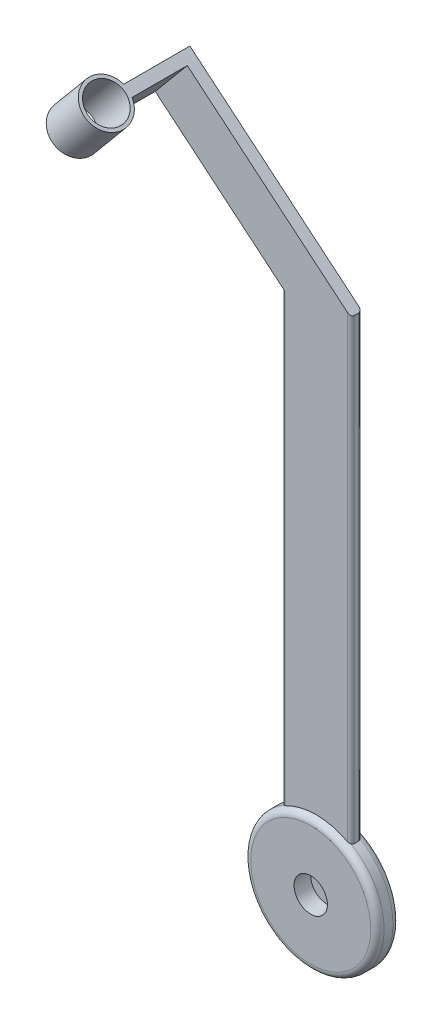
ISO-10303-21;
HEADER;
FILE_DESCRIPTION(('STEP AP214'),'2;1');
FILE_NAME('part.step','',(''),(''),'','','');
FILE_SCHEMA(('AUTOMOTIVE_DESIGN { 1 0 10303 214 1 1 1 1 }'));
ENDSEC;
DATA;
#1=APPLICATION_CONTEXT('core data for automotive mechanical design processes');
#2=APPLICATION_PROTOCOL_DEFINITION('international standard','automotive_design',2000,#1);
#3=PRODUCT_CONTEXT('',#1,'mechanical');
#4=PRODUCT('Part','Part','',(#3));
#5=PRODUCT_RELATED_PRODUCT_CATEGORY('part','',(#4));
#6=PRODUCT_DEFINITION_FORMATION('','',#4);
#7=PRODUCT_DEFINITION_CONTEXT('part definition',#1,'design');
#8=PRODUCT_DEFINITION('design','',#6,#7);
#9=PRODUCT_DEFINITION_SHAPE('','',#8);
#10=(LENGTH_UNIT() NAMED_UNIT(*) SI_UNIT(.MILLI.,.METRE.));
#11=(NAMED_UNIT(*) PLANE_ANGLE_UNIT() SI_UNIT($,.RADIAN.));
#12=(NAMED_UNIT(*) SI_UNIT($,.STERADIAN.) SOLID_ANGLE_UNIT());
#13=UNCERTAINTY_MEASURE_WITH_UNIT(LENGTH_MEASURE(1.E-05),#10,'distance_accuracy_value','');
#14=(GEOMETRIC_REPRESENTATION_CONTEXT(3) GLOBAL_UNCERTAINTY_ASSIGNED_CONTEXT((#13)) GLOBAL_UNIT_ASSIGNED_CONTEXT((#10,
#11,#12)) REPRESENTATION_CONTEXT('',''));
#15=CARTESIAN_POINT('',(0.,0.,0.));
#16=DIRECTION('',(0.,0.,1.));
#17=DIRECTION('',(1.,0.,0.));
#18=AXIS2_PLACEMENT_3D('',#15,#16,#17);
#19=CARTESIAN_POINT('',(0.,0.,5.));
#20=DIRECTION('',(0.,0.,1.));
#21=DIRECTION('',(1.,0.,0.));
#22=AXIS2_PLACEMENT_3D('',#19,#20,#21);
#23=PLANE('',#22);
#24=CARTESIAN_POINT('',(0.,0.,5.));
#25=DIRECTION('',(0.,0.,1.));
#26=DIRECTION('',(1.,0.,0.));
#27=AXIS2_PLACEMENT_3D('',#24,#25,#26);
#28=CIRCLE('',#27,59.9160797830996);
#29=CARTESIAN_POINT('',(-28.,52.971092272812,5.));
#30=VERTEX_POINT('',#29);
#31=CARTESIAN_POINT('',(27.9999999999984,52.9710922728128,5.));
#32=VERTEX_POINT('',#31);
#33=EDGE_CURVE('E212',#30,#32,#28,.F.);
#34=ORIENTED_EDGE('',*,*,#33,.T.);
#35=DIRECTION('',(0.,1.,0.));
#36=VECTOR('',#35,1.);
#37=CARTESIAN_POINT('',(28.,462.733371390838,5.));
#38=LINE('',#37,#36);
#39=CARTESIAN_POINT('',(28.0000000000001,465.237714708431,5.));
#40=VERTEX_POINT('',#39);
#41=EDGE_CURVE('E147',#32,#40,#38,.T.);
#42=ORIENTED_EDGE('',*,*,#41,.T.);
#43=DIRECTION('',(-0.767674400608539,0.640840085083884,0.));
#44=VECTOR('',#43,1.);
#45=CARTESIAN_POINT('',(-123.685053787557,591.861531652329,5.));
#46=LINE('',#45,#44);
#47=CARTESIAN_POINT('',(-116.008309781471,585.45313080149,5.));
#48=VERTEX_POINT('',#47);
#49=EDGE_CURVE('E140',#40,#48,#46,.T.);
#50=ORIENTED_EDGE('',*,*,#49,.T.);
#51=DIRECTION('',(0.640840085083885,0.767674400608539,0.));
#52=VECTOR('',#51,1.);
#53=CARTESIAN_POINT('',(-144.846113610246,550.907782774105,5.));
#54=LINE('',#53,#52);
#55=CARTESIAN_POINT('',(-144.846113610246,550.907782774105,5.));
#56=VERTEX_POINT('',#55);
#57=EDGE_CURVE('E144',#56,#48,#54,.T.);
#58=ORIENTED_EDGE('',*,*,#57,.F.);
#59=DIRECTION('',(0.767674400608539,-0.640840085083885,0.));
#60=VECTOR('',#59,1.);
#61=CARTESIAN_POINT('',(-31.,455.871198156165,5.));
#62=LINE('',#61,#60);
#63=CARTESIAN_POINT('',(-28.,453.366854838572,5.));
#64=VERTEX_POINT('',#63);
#65=EDGE_CURVE('E149',#56,#64,#62,.T.);
#66=ORIENTED_EDGE('',*,*,#65,.T.);
#67=DIRECTION('',(0.,-1.,0.));
#68=VECTOR('',#67,1.);
#69=CARTESIAN_POINT('',(-28.,51.2731568813035,5.));
#70=LINE('',#69,#68);
#71=EDGE_CURVE('E231',#64,#30,#70,.T.);
#72=ORIENTED_EDGE('',*,*,#71,.T.);
#73=EDGE_LOOP('',(#34,#42,#50,#58,#66,#72));
#74=FACE_BOUND('',#73,.T.);
#75=ADVANCED_FACE('F37',(#74),#23,.T.);
#76=CARTESIAN_POINT('',(0.,0.,10.));
#77=DIRECTION('',(0.,0.,-1.));
#78=DIRECTION('',(-1.,0.,0.));
#79=AXIS2_PLACEMENT_3D('',#76,#77,#78);
#80=CYLINDRICAL_SURFACE('',#79,60.);
#81=DIRECTION('',(0.,0.,-1.));
#82=VECTOR('',#81,1.);
#83=CARTESIAN_POINT('',(31.,51.3711981561653,5.));
#84=LINE('',#83,#82);
#85=CARTESIAN_POINT('',(31.,51.3711981561653,2.));
#86=VERTEX_POINT('',#85);
#87=CARTESIAN_POINT('',(31.,51.3711981561653,-2.));
#88=VERTEX_POINT('',#87);
#89=EDGE_CURVE('E193',#86,#88,#84,.T.);
#90=ORIENTED_EDGE('',*,*,#89,.F.);
#91=CARTESIAN_POINT('',(30.9999999999984,51.3711981561653,2.));
#92=CARTESIAN_POINT('',(31.0000135138602,51.3711886335819,2.07598113541307));
#93=CARTESIAN_POINT('',(30.9971138372125,51.3729397825167,2.15195414419648));
#94=CARTESIAN_POINT('',(30.9855914376383,51.3798910633123,2.30327943367493));
#95=CARTESIAN_POINT('',(30.9769707836917,51.3850899483058,2.37863192880714));
#96=CARTESIAN_POINT('',(30.9541612744216,51.3988333183854,2.52782964930783));
#97=CARTESIAN_POINT('',(30.9399977542431,51.4073625807009,2.60168014670068));
#98=CARTESIAN_POINT('',(30.9063027352149,51.4276271639147,2.74767917808667));
#99=CARTESIAN_POINT('',(30.886771072516,51.4393625826729,2.81982766005706));
#100=CARTESIAN_POINT('',(30.8205150646459,51.4791077077944,3.03283060196538));
#101=CARTESIAN_POINT('',(30.766084911078,51.5116834375269,3.17052851994915));
#102=CARTESIAN_POINT('',(30.6390679760402,51.5873330410684,3.43414464767918));
#103=CARTESIAN_POINT('',(30.5664708109147,51.6304129183344,3.56005606390773));
#104=CARTESIAN_POINT('',(30.4477912820482,51.700425524385,3.73581149028256));
#105=CARTESIAN_POINT('',(30.4076177259652,51.724067226756,3.79108982338713));
#106=CARTESIAN_POINT('',(30.3241415292913,51.7730506942354,3.89814511442525));
#107=CARTESIAN_POINT('',(30.2808484213061,51.7983872645411,3.94993187524366));
#108=CARTESIAN_POINT('',(30.2360679774982,51.8245134396852,4.));
#109=B_SPLINE_CURVE_WITH_KNOTS('',3,(#91,#92,#93,#94,#95,#96,#97,#98,#99,#100,#101,#102,#103,
#104,#105,#106,#107,#108),.UNSPECIFIED.,.F.,.F.,(4,2,2,2,2,2,2,2,4),(0.,0.227854449547202,
0.455626540868479,0.682369475436166,0.909119331534355,1.36175812512467,1.81465622518201,
2.03143620298439,2.24757975899714),.UNSPECIFIED.);
#110=CARTESIAN_POINT('',(30.2360679774982,51.8245134396852,4.));
#111=VERTEX_POINT('',#110);
#112=EDGE_CURVE('E288',#86,#111,#109,.T.);
#113=ORIENTED_EDGE('',*,*,#112,.T.);
#114=CARTESIAN_POINT('',(0.,0.,4.));
#115=DIRECTION('',(0.,0.,1.));
#116=DIRECTION('',(1.,0.,0.));
#117=AXIS2_PLACEMENT_3D('',#114,#115,#116);
#118=CIRCLE('',#117,60.);
#119=CARTESIAN_POINT('',(-30.2360679774998,51.8245134396842,4.));
#120=VERTEX_POINT('',#119);
#121=EDGE_CURVE('E53',#111,#120,#118,.F.);
#122=ORIENTED_EDGE('',*,*,#121,.T.);
#123=CARTESIAN_POINT('',(-30.2360679774998,51.8245134396842,4.));
#124=CARTESIAN_POINT('',(-30.2866036341948,51.7950296030769,3.9434972189209));
#125=CARTESIAN_POINT('',(-30.3352456577915,51.7665508935717,3.88480379395856));
#126=CARTESIAN_POINT('',(-30.428396482935,51.7118516539939,3.7631701048231));
#127=CARTESIAN_POINT('',(-30.4729026075026,51.685632587271,3.70022713498815));
#128=CARTESIAN_POINT('',(-30.5999943017241,51.6105614728378,3.50473784951047));
#129=CARTESIAN_POINT('',(-30.675677845471,51.5655736918047,3.3660576124539));
#130=CARTESIAN_POINT('',(-30.8054080275387,51.4881796636025,3.07478192579444));
#131=CARTESIAN_POINT('',(-30.8593634956623,51.4558264474135,2.92213107429976));
#132=CARTESIAN_POINT('',(-30.9214303678558,51.4185345607984,2.68689929527004));
#133=CARTESIAN_POINT('',(-30.9389629029436,51.4079842474134,2.60756777841916));
#134=CARTESIAN_POINT('',(-30.9675709429694,51.3907563439814,2.44735304816715));
#135=CARTESIAN_POINT('',(-30.9786507177719,51.3840761930193,2.36647089752669));
#136=CARTESIAN_POINT('',(-30.9909366436357,51.3766666039312,2.23783299375553));
#137=CARTESIAN_POINT('',(-30.9943337904966,51.3746171161507,2.19034699973049));
#138=CARTESIAN_POINT('',(-30.9988655298601,51.3718827666341,2.09524345286393));
#139=CARTESIAN_POINT('',(-31.0000008531338,51.3711974641442,2.04762594749307));
#140=CARTESIAN_POINT('',(-31.,51.3711981561653,2.));
#141=B_SPLINE_CURVE_WITH_KNOTS('',3,(#123,#124,#125,#126,#127,#128,#129,#130,#131,#132,#133,
#134,#135,#136,#137,#138,#139,#140),.UNSPECIFIED.,.F.,.F.,(4,2,2,2,2,2,2,2,4),(0.,
0.243905686519649,0.487968158258557,0.978352612674352,1.47077378314476,1.71626088903809,
1.9615853682267,2.10447429049845,2.24731703937925),.UNSPECIFIED.);
#142=CARTESIAN_POINT('',(-31.,51.3711981561653,2.));
#143=VERTEX_POINT('',#142);
#144=EDGE_CURVE('E46',#120,#143,#141,.T.);
#145=ORIENTED_EDGE('',*,*,#144,.T.);
#146=DIRECTION('',(0.,0.,-1.));
#147=VECTOR('',#146,1.);
#148=CARTESIAN_POINT('',(-31.,51.3711981561653,5.));
#149=LINE('',#148,#147);
#150=CARTESIAN_POINT('',(-31.,51.3711981561653,-2.));
#151=VERTEX_POINT('',#150);
#152=EDGE_CURVE('E175',#143,#151,#149,.T.);
#153=ORIENTED_EDGE('',*,*,#152,.T.);
#154=CARTESIAN_POINT('',(-31.,51.3711981561653,-2.));
#155=CARTESIAN_POINT('',(-31.0000135138619,51.3711886335813,-2.07598113541309));
#156=CARTESIAN_POINT('',(-30.9971138372141,51.3729397825158,-2.15195414419652));
#157=CARTESIAN_POINT('',(-30.9855914376399,51.3798910633112,-2.30327943367498));
#158=CARTESIAN_POINT('',(-30.9769707836933,51.3850899483048,-2.37863192880718));
#159=CARTESIAN_POINT('',(-30.9541612744232,51.3988333183844,-2.52782964930786));
#160=CARTESIAN_POINT('',(-30.9399977542448,51.4073625806999,-2.6016801467007));
#161=CARTESIAN_POINT('',(-30.9063027352165,51.4276271639137,-2.74767917808668));
#162=CARTESIAN_POINT('',(-30.8867710725176,51.4393625826719,-2.81982766005706));
#163=CARTESIAN_POINT('',(-30.8205150646475,51.4791077077935,-3.03283060196536));
#164=CARTESIAN_POINT('',(-30.7660849110796,51.5116834375259,-3.17052851994914));
#165=CARTESIAN_POINT('',(-30.6390679760419,51.5873330410674,-3.43414464767916));
#166=CARTESIAN_POINT('',(-30.5664708109164,51.6304129183334,-3.56005606390771));
#167=CARTESIAN_POINT('',(-30.4477912820498,51.700425524384,-3.73581149028255));
#168=CARTESIAN_POINT('',(-30.4076177259668,51.724067226755,-3.79108982338712));
#169=CARTESIAN_POINT('',(-30.324141529293,51.7730506942344,-3.89814511442525));
#170=CARTESIAN_POINT('',(-30.2808484213077,51.7983872645401,-3.94993187524366));
#171=CARTESIAN_POINT('',(-30.2360679774998,51.8245134396842,-4.));
#172=B_SPLINE_CURVE_WITH_KNOTS('',3,(#154,#155,#156,#157,#158,#159,#160,#161,#162,#163,#164,
#165,#166,#167,#168,#169,#170,#171),.UNSPECIFIED.,.F.,.F.,(4,2,2,2,2,2,2,2,4),(0.,
0.227854449547223,0.455626540868497,0.682369475436157,0.909119331534326,1.36175812512463,
1.81465622518198,2.03143620298438,2.24757975899712),.UNSPECIFIED.);
#173=CARTESIAN_POINT('',(-30.2360679774998,51.8245134396842,-4.));
#174=VERTEX_POINT('',#173);
#175=EDGE_CURVE('E272',#151,#174,#172,.T.);
#176=ORIENTED_EDGE('',*,*,#175,.T.);
#177=CARTESIAN_POINT('',(0.,0.,-4.));
#178=DIRECTION('',(0.,0.,1.));
#179=DIRECTION('',(1.,0.,0.));
#180=AXIS2_PLACEMENT_3D('',#177,#178,#179);
#181=CIRCLE('',#180,60.);
#182=CARTESIAN_POINT('',(30.2360679774982,51.8245134396852,-4.));
#183=VERTEX_POINT('',#182);
#184=EDGE_CURVE('E61',#174,#183,#181,.T.);
#185=ORIENTED_EDGE('',*,*,#184,.T.);
#186=CARTESIAN_POINT('',(30.2360679774982,51.8245134396852,-4.));
#187=CARTESIAN_POINT('',(30.2866036341931,51.7950296030778,-3.94349721892089));
#188=CARTESIAN_POINT('',(30.3352456577899,51.7665508935727,-3.88480379395856));
#189=CARTESIAN_POINT('',(30.4283964829333,51.7118516539949,-3.7631701048231));
#190=CARTESIAN_POINT('',(30.472902607501,51.685632587272,-3.70022713498815));
#191=CARTESIAN_POINT('',(30.5999943017224,51.6105614728388,-3.50473784951046));
#192=CARTESIAN_POINT('',(30.6756778454693,51.5655736918057,-3.3660576124539));
#193=CARTESIAN_POINT('',(30.8054080275371,51.4881796636034,-3.07478192579444));
#194=CARTESIAN_POINT('',(30.8593634956606,51.4558264474145,-2.92213107429976));
#195=CARTESIAN_POINT('',(30.9214303678542,51.4185345607994,-2.68689929527004));
#196=CARTESIAN_POINT('',(30.938962902942,51.4079842474144,-2.60756777841916));
#197=CARTESIAN_POINT('',(30.9675709429677,51.3907563439824,-2.44735304816715));
#198=CARTESIAN_POINT('',(30.9786507177702,51.3840761930203,-2.36647089752669));
#199=CARTESIAN_POINT('',(30.990936643634,51.3766666039322,-2.23783299375552));
#200=CARTESIAN_POINT('',(30.994333790495,51.3746171161517,-2.19034699973047));
#201=CARTESIAN_POINT('',(30.9988655298584,51.3718827666351,-2.09524345286389));
#202=CARTESIAN_POINT('',(31.0000008531322,51.3711974641452,-2.04762594749303));
#203=CARTESIAN_POINT('',(30.9999999999984,51.3711981561663,-1.99999999999994));
#204=B_SPLINE_CURVE_WITH_KNOTS('',3,(#186,#187,#188,#189,#190,#191,#192,#193,#194,#195,#196,
#197,#198,#199,#200,#201,#202,#203),.UNSPECIFIED.,.F.,.F.,(4,2,2,2,2,2,2,2,4),(0.,
0.243905686519649,0.487968158258554,0.978352612674348,1.47077378314475,1.71626088903808,
1.96158536822669,2.10447429049847,2.24731703937929),.UNSPECIFIED.);
#205=EDGE_CURVE('E247',#183,#88,#204,.T.);
#206=ORIENTED_EDGE('',*,*,#205,.T.);
#207=EDGE_LOOP('',(#90,#113,#122,#145,#153,#176,#185,#206));
#208=FACE_BOUND('',#207,.T.);
#209=ADVANCED_FACE('F302',(#208),#80,.T.);
#210=CARTESIAN_POINT('',(0.,0.,10.));
#211=DIRECTION('',(0.,0.,1.));
#212=DIRECTION('',(1.,0.,0.));
#213=AXIS2_PLACEMENT_3D('',#210,#211,#212);
#214=PLANE('',#213);
#215=CARTESIAN_POINT('',(0.,0.,10.));
#216=DIRECTION('',(0.,0.,1.));
#217=DIRECTION('',(1.,0.,0.));
#218=AXIS2_PLACEMENT_3D('',#215,#216,#217);
#219=CIRCLE('',#218,54.);
#220=CARTESIAN_POINT('',(54.,0.,10.));
#221=VERTEX_POINT('',#220);
#222=EDGE_CURVE('E204',#221,#221,#219,.T.);
#223=ORIENTED_EDGE('',*,*,#222,.T.);
#224=EDGE_LOOP('',(#223));
#225=FACE_BOUND('',#224,.T.);
#226=CARTESIAN_POINT('',(0.,0.,10.));
#227=DIRECTION('',(0.,0.,1.));
#228=DIRECTION('',(1.,0.,0.));
#229=AXIS2_PLACEMENT_3D('',#226,#227,#228);
#230=CIRCLE('',#229,15.);
#231=CARTESIAN_POINT('',(15.,0.,10.));
#232=VERTEX_POINT('',#231);
#233=EDGE_CURVE('E196',#232,#232,#230,.T.);
#234=ORIENTED_EDGE('',*,*,#233,.F.);
#235=EDGE_LOOP('',(#234));
#236=FACE_BOUND('',#235,.T.);
#237=ADVANCED_FACE('F349',(#225,#236),#214,.T.);
#238=CARTESIAN_POINT('',(0.,0.,-10.));
#239=DIRECTION('',(0.,0.,1.));
#240=DIRECTION('',(1.,0.,0.));
#241=AXIS2_PLACEMENT_3D('',#238,#239,#240);
#242=PLANE('',#241);
#243=CARTESIAN_POINT('',(0.,0.,-10.));
#244=DIRECTION('',(0.,0.,1.));
#245=DIRECTION('',(1.,0.,0.));
#246=AXIS2_PLACEMENT_3D('',#243,#244,#245);
#247=CIRCLE('',#246,54.);
#248=CARTESIAN_POINT('',(54.,0.,-10.));
#249=VERTEX_POINT('',#248);
#250=EDGE_CURVE('E209',#249,#249,#247,.F.);
#251=ORIENTED_EDGE('',*,*,#250,.T.);
#252=EDGE_LOOP('',(#251));
#253=FACE_BOUND('',#252,.T.);
#254=ADVANCED_FACE('F425',(#253),#242,.F.);
#255=CARTESIAN_POINT('',(0.,0.,-5.));
#256=DIRECTION('',(0.,0.,1.));
#257=DIRECTION('',(1.,0.,0.));
#258=AXIS2_PLACEMENT_3D('',#255,#256,#257);
#259=CYLINDRICAL_SURFACE('',#258,15.);
#260=CARTESIAN_POINT('',(0.,0.,-5.));
#261=DIRECTION('',(0.,0.,1.));
#262=DIRECTION('',(1.,0.,0.));
#263=AXIS2_PLACEMENT_3D('',#260,#261,#262);
#264=CIRCLE('',#263,15.);
#265=CARTESIAN_POINT('',(15.,0.,-5.));
#266=VERTEX_POINT('',#265);
#267=EDGE_CURVE('E197',#266,#266,#264,.T.);
#268=ORIENTED_EDGE('',*,*,#267,.F.);
#269=EDGE_LOOP('',(#268));
#270=FACE_BOUND('',#269,.T.);
#271=ORIENTED_EDGE('',*,*,#233,.T.);
#272=EDGE_LOOP('',(#271));
#273=FACE_BOUND('',#272,.T.);
#274=ADVANCED_FACE('F430',(#270,#273),#259,.F.);
#275=CARTESIAN_POINT('',(0.,0.,-5.));
#276=DIRECTION('',(0.,0.,1.));
#277=DIRECTION('',(1.,0.,0.));
#278=AXIS2_PLACEMENT_3D('',#275,#276,#277);
#279=PLANE('',#278);
#280=ORIENTED_EDGE('',*,*,#267,.T.);
#281=EDGE_LOOP('',(#280));
#282=FACE_BOUND('',#281,.T.);
#283=ADVANCED_FACE('F342',(#282),#279,.T.);
#284=CARTESIAN_POINT('',(31.,455.871198156165,5.));
#285=DIRECTION('',(-1.,0.,0.));
#286=DIRECTION('',(0.,-1.,0.));
#287=AXIS2_PLACEMENT_3D('',#284,#285,#286);
#288=PLANE('',#287);
#289=ORIENTED_EDGE('',*,*,#89,.T.);
#290=DIRECTION('',(0.,1.,0.));
#291=VECTOR('',#290,1.);
#292=CARTESIAN_POINT('',(31.,455.871198156165,-2.));
#293=LINE('',#292,#291);
#294=CARTESIAN_POINT('',(31.,462.733371390838,-2.));
#295=VERTEX_POINT('',#294);
#296=EDGE_CURVE('E219',#88,#295,#293,.T.);
#297=ORIENTED_EDGE('',*,*,#296,.T.);
#298=DIRECTION('',(0.,0.,-1.));
#299=VECTOR('',#298,1.);
#300=CARTESIAN_POINT('',(31.,462.733371390838,5.));
#301=LINE('',#300,#299);
#302=CARTESIAN_POINT('',(31.,462.733371390838,2.));
#303=VERTEX_POINT('',#302);
#304=EDGE_CURVE('E191',#303,#295,#301,.T.);
#305=ORIENTED_EDGE('',*,*,#304,.F.);
#306=DIRECTION('',(0.,1.,0.));
#307=VECTOR('',#306,1.);
#308=CARTESIAN_POINT('',(30.9999999999984,51.2731568813045,2.));
#309=LINE('',#308,#307);
#310=EDGE_CURVE('E217',#303,#86,#309,.F.);
#311=ORIENTED_EDGE('',*,*,#310,.T.);
#312=EDGE_LOOP('',(#289,#297,#305,#311));
#313=FACE_BOUND('',#312,.T.);
#314=ADVANCED_FACE('F307',(#313),#288,.F.);
#315=CARTESIAN_POINT('',(-123.685053787557,591.861531652329,5.));
#316=DIRECTION('',(-0.640840085083884,-0.767674400608539,0.));
#317=DIRECTION('',(0.767674400608539,-0.640840085083884,0.));
#318=AXIS2_PLACEMENT_3D('',#315,#316,#317);
#319=PLANE('',#318);
#320=ORIENTED_EDGE('',*,*,#304,.T.);
#321=CARTESIAN_POINT('',(28.,465.237714708431,-2.));
#322=DIRECTION('',(-0.640840085083884,-0.767674400608539,0.));
#323=DIRECTION('',(-0.767674400608539,0.640840085083884,0.));
#324=AXIS2_PLACEMENT_3D('',#321,#322,#323);
#325=ELLIPSE('',#324,3.90790678655153,3.);
#326=CARTESIAN_POINT('',(28.0000000000001,465.237714708431,-5.));
#327=VERTEX_POINT('',#326);
#328=EDGE_CURVE('E224',#295,#327,#325,.F.);
#329=ORIENTED_EDGE('',*,*,#328,.T.);
#330=DIRECTION('',(-0.767674400608539,0.640840085083884,0.));
#331=VECTOR('',#330,1.);
#332=CARTESIAN_POINT('',(-123.685053787557,591.861531652329,-5.));
#333=LINE('',#332,#331);
#334=CARTESIAN_POINT('',(-123.685053787557,591.861531652329,-5.));
#335=VERTEX_POINT('',#334);
#336=EDGE_CURVE('E172',#327,#335,#333,.T.);
#337=ORIENTED_EDGE('',*,*,#336,.T.);
#338=DIRECTION('',(0.,0.,-1.));
#339=VECTOR('',#338,1.);
#340=CARTESIAN_POINT('',(-123.685053787557,591.861531652329,5.));
#341=LINE('',#340,#339);
#342=CARTESIAN_POINT('',(-123.685053787557,591.861531652329,54.6350832689629));
#343=VERTEX_POINT('',#342);
#344=EDGE_CURVE('E188',#343,#335,#341,.T.);
#345=ORIENTED_EDGE('',*,*,#344,.F.);
#346=CARTESIAN_POINT('',(-119.846681784514,588.657331226909,74.));
#347=DIRECTION('',(0.640840085083885,0.767674400608539,0.));
#348=DIRECTION('',(-0.767674400608539,0.640840085083884,0.));
#349=AXIS2_PLACEMENT_3D('',#346,#347,#348);
#350=CIRCLE('',#349,20.);
#351=CARTESIAN_POINT('',(-116.008309781471,585.45313080149,54.6350832689629));
#352=VERTEX_POINT('',#351);
#353=EDGE_CURVE('E159',#343,#352,#350,.T.);
#354=ORIENTED_EDGE('',*,*,#353,.T.);
#355=DIRECTION('',(0.,0.,-1.));
#356=VECTOR('',#355,1.);
#357=CARTESIAN_POINT('',(-116.008309781471,585.45313080149,55.));
#358=LINE('',#357,#356);
#359=EDGE_CURVE('E153',#352,#48,#358,.T.);
#360=ORIENTED_EDGE('',*,*,#359,.T.);
#361=ORIENTED_EDGE('',*,*,#49,.F.);
#362=CARTESIAN_POINT('',(28.,465.237714708431,2.));
#363=DIRECTION('',(-0.640840085083884,-0.767674400608539,0.));
#364=DIRECTION('',(0.767674400608539,-0.640840085083884,0.));
#365=AXIS2_PLACEMENT_3D('',#362,#363,#364);
#366=ELLIPSE('',#365,3.90790678655153,3.);
#367=EDGE_CURVE('E222',#40,#303,#366,.F.);
#368=ORIENTED_EDGE('',*,*,#367,.T.);
#369=EDGE_LOOP('',(#320,#329,#337,#345,#354,#360,#361,#368));
#370=FACE_BOUND('',#369,.T.);
#371=CARTESIAN_POINT('',(-119.846681784514,588.657331226909,74.));
#372=DIRECTION('',(0.640840085083885,0.767674400608539,0.));
#373=DIRECTION('',(-0.767674400608539,0.640840085083884,0.));
#374=AXIS2_PLACEMENT_3D('',#371,#372,#373);
#375=CIRCLE('',#374,17.);
#376=CARTESIAN_POINT('',(-132.89714659486,599.551612673335,74.));
#377=VERTEX_POINT('',#376);
#378=EDGE_CURVE('E327',#377,#377,#375,.T.);
#379=ORIENTED_EDGE('',*,*,#378,.F.);
#380=EDGE_LOOP('',(#379));
#381=FACE_BOUND('',#380,.T.);
#382=ADVANCED_FACE('F155',(#370,#381),#319,.F.);
#383=CARTESIAN_POINT('',(-152.522857616332,557.316183624944,5.));
#384=DIRECTION('',(0.767674400608539,-0.640840085083885,0.));
#385=DIRECTION('',(0.640840085083885,0.767674400608539,0.));
#386=AXIS2_PLACEMENT_3D('',#383,#384,#385);
#387=PLANE('',#386);
#388=DIRECTION('',(0.,0.,-1.));
#389=VECTOR('',#388,1.);
#390=CARTESIAN_POINT('',(-152.522857616332,557.316183624944,5.));
#391=LINE('',#390,#389);
#392=CARTESIAN_POINT('',(-152.522857616332,557.316183624944,54.6350832689629));
#393=VERTEX_POINT('',#392);
#394=CARTESIAN_POINT('',(-152.522857616332,557.316183624944,-5.));
#395=VERTEX_POINT('',#394);
#396=EDGE_CURVE('E186',#393,#395,#391,.T.);
#397=ORIENTED_EDGE('',*,*,#396,.F.);
#398=DIRECTION('',(0.640840085083885,0.767674400608539,0.));
#399=VECTOR('',#398,1.);
#400=CARTESIAN_POINT('',(-152.522857616332,557.316183624944,54.6350832689629));
#401=LINE('',#400,#399);
#402=EDGE_CURVE('E166',#393,#343,#401,.T.);
#403=ORIENTED_EDGE('',*,*,#402,.T.);
#404=ORIENTED_EDGE('',*,*,#344,.T.);
#405=DIRECTION('',(-0.640840085083885,-0.767674400608539,0.));
#406=VECTOR('',#405,1.);
#407=CARTESIAN_POINT('',(-152.522857616332,557.316183624944,-5.));
#408=LINE('',#407,#406);
#409=EDGE_CURVE('E177',#335,#395,#408,.T.);
#410=ORIENTED_EDGE('',*,*,#409,.T.);
#411=EDGE_LOOP('',(#397,#403,#404,#410));
#412=FACE_BOUND('',#411,.T.);
#413=ADVANCED_FACE('F318',(#412),#387,.F.);
#414=CARTESIAN_POINT('',(-31.,455.871198156165,5.));
#415=DIRECTION('',(0.640840085083885,0.767674400608539,0.));
#416=DIRECTION('',(-0.767674400608539,0.640840085083885,0.));
#417=AXIS2_PLACEMENT_3D('',#414,#415,#416);
#418=PLANE('',#417);
#419=CARTESIAN_POINT('',(-148.684485613289,554.111983199525,74.));
#420=DIRECTION('',(0.640840085083885,0.767674400608539,0.));
#421=DIRECTION('',(-0.767674400608539,0.640840085083884,0.));
#422=AXIS2_PLACEMENT_3D('',#419,#420,#421);
#423=CIRCLE('',#422,20.);
#424=CARTESIAN_POINT('',(-144.846113610246,550.907782774105,54.6350832689629));
#425=VERTEX_POINT('',#424);
#426=EDGE_CURVE('E168',#393,#425,#423,.T.);
#427=ORIENTED_EDGE('',*,*,#426,.F.);
#428=ORIENTED_EDGE('',*,*,#396,.T.);
#429=DIRECTION('',(0.767674400608539,-0.640840085083885,0.));
#430=VECTOR('',#429,1.);
#431=CARTESIAN_POINT('',(-31.,455.871198156165,-5.));
#432=LINE('',#431,#430);
#433=CARTESIAN_POINT('',(-28.,453.366854838572,-5.));
#434=VERTEX_POINT('',#433);
#435=EDGE_CURVE('E150',#395,#434,#432,.T.);
#436=ORIENTED_EDGE('',*,*,#435,.T.);
#437=CARTESIAN_POINT('',(-28.,453.366854838572,-2.));
#438=DIRECTION('',(0.640840085083885,0.767674400608539,0.));
#439=DIRECTION('',(0.767674400608539,-0.640840085083885,0.));
#440=AXIS2_PLACEMENT_3D('',#437,#438,#439);
#441=ELLIPSE('',#440,3.90790678655155,3.);
#442=CARTESIAN_POINT('',(-31.,455.871198156165,-2.));
#443=VERTEX_POINT('',#442);
#444=EDGE_CURVE('E271',#434,#443,#441,.T.);
#445=ORIENTED_EDGE('',*,*,#444,.T.);
#446=DIRECTION('',(0.,0.,-1.));
#447=VECTOR('',#446,1.);
#448=CARTESIAN_POINT('',(-31.,455.871198156165,5.));
#449=LINE('',#448,#447);
#450=CARTESIAN_POINT('',(-31.,455.871198156165,2.));
#451=VERTEX_POINT('',#450);
#452=EDGE_CURVE('E183',#451,#443,#449,.T.);
#453=ORIENTED_EDGE('',*,*,#452,.F.);
#454=CARTESIAN_POINT('',(-28.,453.366854838572,2.));
#455=DIRECTION('',(0.640840085083885,0.767674400608539,0.));
#456=DIRECTION('',(-0.767674400608539,0.640840085083885,0.));
#457=AXIS2_PLACEMENT_3D('',#454,#455,#456);
#458=ELLIPSE('',#457,3.90790678655155,3.);
#459=EDGE_CURVE('E11',#451,#64,#458,.T.);
#460=ORIENTED_EDGE('',*,*,#459,.T.);
#461=ORIENTED_EDGE('',*,*,#65,.F.);
#462=DIRECTION('',(0.,0.,-1.));
#463=VECTOR('',#462,1.);
#464=CARTESIAN_POINT('',(-144.846113610246,550.907782774105,55.));
#465=LINE('',#464,#463);
#466=EDGE_CURVE('E162',#425,#56,#465,.T.);
#467=ORIENTED_EDGE('',*,*,#466,.F.);
#468=EDGE_LOOP('',(#427,#428,#436,#445,#453,#460,#461,#467));
#469=FACE_BOUND('',#468,.T.);
#470=CARTESIAN_POINT('',(-148.684485613289,554.111983199525,74.));
#471=DIRECTION('',(0.640840085083885,0.767674400608539,0.));
#472=DIRECTION('',(-0.767674400608539,0.640840085083884,0.));
#473=AXIS2_PLACEMENT_3D('',#470,#471,#472);
#474=CIRCLE('',#473,17.);
#475=CARTESIAN_POINT('',(-161.734950423634,565.006264645951,74.));
#476=VERTEX_POINT('',#475);
#477=EDGE_CURVE('E324',#476,#476,#474,.T.);
#478=ORIENTED_EDGE('',*,*,#477,.T.);
#479=EDGE_LOOP('',(#478));
#480=FACE_BOUND('',#479,.T.);
#481=ADVANCED_FACE('F340',(#469,#480),#418,.F.);
#482=CARTESIAN_POINT('',(-31.,51.3711981561653,5.));
#483=DIRECTION('',(1.,0.,0.));
#484=DIRECTION('',(0.,0.,-1.));
#485=AXIS2_PLACEMENT_3D('',#482,#483,#484);
#486=PLANE('',#485);
#487=ORIENTED_EDGE('',*,*,#452,.T.);
#488=DIRECTION('',(0.,-1.,0.));
#489=VECTOR('',#488,1.);
#490=CARTESIAN_POINT('',(-31.,51.3711981561653,-2.));
#491=LINE('',#490,#489);
#492=EDGE_CURVE('E237',#443,#151,#491,.T.);
#493=ORIENTED_EDGE('',*,*,#492,.T.);
#494=ORIENTED_EDGE('',*,*,#152,.F.);
#495=DIRECTION('',(0.,-1.,0.));
#496=VECTOR('',#495,1.);
#497=CARTESIAN_POINT('',(-31.,455.871198156165,2.));
#498=LINE('',#497,#496);
#499=EDGE_CURVE('E235',#143,#451,#498,.F.);
#500=ORIENTED_EDGE('',*,*,#499,.T.);
#501=EDGE_LOOP('',(#487,#493,#494,#500));
#502=FACE_BOUND('',#501,.T.);
#503=ADVANCED_FACE('F355',(#502),#486,.F.);
#504=CARTESIAN_POINT('',(0.,0.,-5.));
#505=DIRECTION('',(0.,0.,1.));
#506=DIRECTION('',(1.,0.,0.));
#507=AXIS2_PLACEMENT_3D('',#504,#505,#506);
#508=PLANE('',#507);
#509=ORIENTED_EDGE('',*,*,#336,.F.);
#510=DIRECTION('',(0.,1.,0.));
#511=VECTOR('',#510,1.);
#512=CARTESIAN_POINT('',(27.9999999999982,-1.13252185664858E-13,-5.));
#513=LINE('',#512,#511);
#514=CARTESIAN_POINT('',(27.9999999999984,52.9710922728128,-5.));
#515=VERTEX_POINT('',#514);
#516=EDGE_CURVE('E229',#327,#515,#513,.F.);
#517=ORIENTED_EDGE('',*,*,#516,.T.);
#518=CARTESIAN_POINT('',(0.,0.,-5.));
#519=DIRECTION('',(0.,0.,1.));
#520=DIRECTION('',(1.,0.,0.));
#521=AXIS2_PLACEMENT_3D('',#518,#519,#520);
#522=CIRCLE('',#521,59.9160797830996);
#523=CARTESIAN_POINT('',(-28.,52.971092272812,-5.));
#524=VERTEX_POINT('',#523);
#525=EDGE_CURVE('E214',#515,#524,#522,.T.);
#526=ORIENTED_EDGE('',*,*,#525,.T.);
#527=DIRECTION('',(0.,-1.,0.));
#528=VECTOR('',#527,1.);
#529=CARTESIAN_POINT('',(-28.,0.,-5.));
#530=LINE('',#529,#528);
#531=EDGE_CURVE('E226',#524,#434,#530,.F.);
#532=ORIENTED_EDGE('',*,*,#531,.T.);
#533=ORIENTED_EDGE('',*,*,#435,.F.);
#534=ORIENTED_EDGE('',*,*,#409,.F.);
#535=EDGE_LOOP('',(#509,#517,#526,#532,#533,#534));
#536=FACE_BOUND('',#535,.T.);
#537=ADVANCED_FACE('F314',(#536),#508,.F.);
#538=CARTESIAN_POINT('',(-144.846113610246,550.907782774105,55.));
#539=DIRECTION('',(-0.767674400608539,0.640840085083885,0.));
#540=DIRECTION('',(-0.640840085083885,-0.767674400608539,0.));
#541=AXIS2_PLACEMENT_3D('',#538,#539,#540);
#542=PLANE('',#541);
#543=ORIENTED_EDGE('',*,*,#359,.F.);
#544=DIRECTION('',(0.640840085083885,0.767674400608539,0.));
#545=VECTOR('',#544,1.);
#546=CARTESIAN_POINT('',(-144.846113610246,550.907782774105,54.6350832689629));
#547=LINE('',#546,#545);
#548=EDGE_CURVE('E200',#352,#425,#547,.F.);
#549=ORIENTED_EDGE('',*,*,#548,.T.);
#550=ORIENTED_EDGE('',*,*,#466,.T.);
#551=ORIENTED_EDGE('',*,*,#57,.T.);
#552=EDGE_LOOP('',(#543,#549,#550,#551));
#553=FACE_BOUND('',#552,.T.);
#554=ADVANCED_FACE('F164',(#553),#542,.F.);
#555=CARTESIAN_POINT('',(-148.684485613289,554.111983199525,74.));
#556=DIRECTION('',(0.640840085083885,0.767674400608539,0.));
#557=DIRECTION('',(-0.767674400608539,0.640840085083885,0.));
#558=AXIS2_PLACEMENT_3D('',#555,#556,#557);
#559=CYLINDRICAL_SURFACE('',#558,20.);
#560=ORIENTED_EDGE('',*,*,#402,.F.);
#561=ORIENTED_EDGE('',*,*,#426,.T.);
#562=ORIENTED_EDGE('',*,*,#548,.F.);
#563=ORIENTED_EDGE('',*,*,#353,.F.);
#564=EDGE_LOOP('',(#560,#561,#562,#563));
#565=FACE_BOUND('',#564,.T.);
#566=ADVANCED_FACE('F321',(#565),#559,.T.);
#567=CARTESIAN_POINT('',(-148.684485613289,554.111983199525,74.));
#568=DIRECTION('',(0.640840085083885,0.767674400608539,0.));
#569=DIRECTION('',(-0.767674400608539,0.640840085083885,0.));
#570=AXIS2_PLACEMENT_3D('',#567,#568,#569);
#571=CYLINDRICAL_SURFACE('',#570,17.);
#572=ORIENTED_EDGE('',*,*,#477,.F.);
#573=EDGE_LOOP('',(#572));
#574=FACE_BOUND('',#573,.T.);
#575=ORIENTED_EDGE('',*,*,#378,.T.);
#576=EDGE_LOOP('',(#575));
#577=FACE_BOUND('',#576,.T.);
#578=ADVANCED_FACE('F333',(#574,#577),#571,.F.);
#579=CARTESIAN_POINT('',(0.,0.,4.));
#580=DIRECTION('',(0.,0.,1.));
#581=DIRECTION('',(1.,0.,0.));
#582=AXIS2_PLACEMENT_3D('',#579,#580,#581);
#583=TOROIDAL_SURFACE('',#582,54.,6.);
#584=ORIENTED_EDGE('',*,*,#33,.F.);
#585=CARTESIAN_POINT('',(-28.,52.971092272812,5.));
#586=CARTESIAN_POINT('',(-28.0910379329399,52.9229498443095,5.00000579521113));
#587=CARTESIAN_POINT('',(-28.1823057204161,52.8752184461355,4.99585584350541));
#588=CARTESIAN_POINT('',(-28.3646488313574,52.7807986657314,4.97916220910305));
#589=CARTESIAN_POINT('',(-28.4557240826009,52.7341106276536,4.96661579786369));
#590=CARTESIAN_POINT('',(-28.6372050167089,52.6419106671637,4.93300334608468));
#591=CARTESIAN_POINT('',(-28.7276083489168,52.5964021109511,4.91191528290149));
#592=CARTESIAN_POINT('',(-28.9067096607535,52.5068300412985,4.86121252152228));
#593=CARTESIAN_POINT('',(-28.9954079002157,52.4627663069529,4.83159913363807));
#594=CARTESIAN_POINT('',(-29.1705099637957,52.3760146703756,4.76382755838683));
#595=CARTESIAN_POINT('',(-29.2569070093437,52.3333307674751,4.72564670645122));
#596=CARTESIAN_POINT('',(-29.4262688625365,52.2494288984998,4.64096928885672));
#597=CARTESIAN_POINT('',(-29.5092338277939,52.2082108651197,4.59447310558854));
#598=CARTESIAN_POINT('',(-29.6705919449236,52.1272420139614,4.49362163872848));
#599=CARTESIAN_POINT('',(-29.7489979145813,52.0874872107271,4.43929004962335));
#600=CARTESIAN_POINT('',(-29.900591305214,52.0091438919106,4.32311465138641));
#601=CARTESIAN_POINT('',(-29.973781966999,51.9705546607813,4.26127557318897));
#602=CARTESIAN_POINT('',(-30.0774053348602,51.9142477843467,4.16482770434969));
#603=CARTESIAN_POINT('',(-30.1101734122624,51.8961737665923,4.13290031066185));
#604=CARTESIAN_POINT('',(-30.1742360569852,51.8602145731389,4.06755627188243));
#605=CARTESIAN_POINT('',(-30.2055317831025,51.8423292578256,4.03414083966645));
#606=CARTESIAN_POINT('',(-30.2360679774998,51.8245134396842,4.));
#607=B_SPLINE_CURVE_WITH_KNOTS('',3,(#585,#586,#587,#588,#589,#590,#591,#592,#593,#594,#595,
#596,#597,#598,#599,#600,#601,#602,#603,#604,#605,#606),.UNSPECIFIED.,.F.,.F.,(4,2,2,2,2,2,2,2,
2,2,4),(0.,0.30888259970514,0.617865623746552,0.927650410981759,1.23738761080282,
1.5479540642586,1.85850623960555,2.16813825781501,2.47757616072251,2.62511150475173,
2.77252872080333),.UNSPECIFIED.);
#608=EDGE_CURVE('E499',#30,#120,#607,.T.);
#609=ORIENTED_EDGE('',*,*,#608,.T.);
#610=ORIENTED_EDGE('',*,*,#121,.F.);
#611=CARTESIAN_POINT('',(30.2360679774982,51.8245134396852,4.));
#612=CARTESIAN_POINT('',(30.1748178194124,51.8602497049581,4.06850652204414));
#613=CARTESIAN_POINT('',(30.1104772872809,51.8962830112811,4.13408209839641));
#614=CARTESIAN_POINT('',(29.9763350335486,51.9691614604908,4.25886282093044));
#615=CARTESIAN_POINT('',(29.9065342517239,52.0060064628938,4.31806905920526));
#616=CARTESIAN_POINT('',(29.7622877056467,52.0806770061534,4.42953512106645));
#617=CARTESIAN_POINT('',(29.6878497329552,52.1185008429801,4.48180615820939));
#618=CARTESIAN_POINT('',(29.5350131781654,52.1953362625317,4.57913788970458));
#619=CARTESIAN_POINT('',(29.4566146968032,52.2343478150369,4.62419876732661));
#620=CARTESIAN_POINT('',(29.2166263845769,52.3533585469782,4.7481199212263));
#621=CARTESIAN_POINT('',(29.0501260548246,52.4353929891681,4.81580876679269));
#622=CARTESIAN_POINT('',(28.7105070288355,52.6047590843086,4.92005830730853));
#623=CARTESIAN_POINT('',(28.5373954867072,52.6920850680598,4.9566517067092));
#624=CARTESIAN_POINT('',(28.3030804102337,52.8126229408903,4.98527801581108));
#625=CARTESIAN_POINT('',(28.2423878852,52.8440551706486,4.99081153184624));
#626=CARTESIAN_POINT('',(28.1211069992781,52.9072952230739,4.99816763899768));
#627=CARTESIAN_POINT('',(28.060518639768,52.9391023021871,4.99999663120025));
#628=CARTESIAN_POINT('',(27.9999999999984,52.9710922728128,5.));
#629=B_SPLINE_CURVE_WITH_KNOTS('',3,(#611,#612,#613,#614,#615,#616,#617,#618,#619,#620,#621,
#622,#623,#624,#625,#626,#627,#628),.UNSPECIFIED.,.F.,.F.,(4,2,2,2,2,2,2,2,4),(0.,
0.2956926591951,0.591334537553791,0.886492409231333,1.18164277731391,1.77147102154448,
2.3606781468886,2.56632037599044,2.77160696951),.UNSPECIFIED.);
#630=EDGE_CURVE('E292',#111,#32,#629,.T.);
#631=ORIENTED_EDGE('',*,*,#630,.T.);
#632=EDGE_LOOP('',(#584,#609,#610,#631));
#633=FACE_BOUND('',#632,.T.);
#634=ORIENTED_EDGE('',*,*,#222,.F.);
#635=EDGE_LOOP('',(#634));
#636=FACE_BOUND('',#635,.T.);
#637=ADVANCED_FACE('F260',(#633,#636),#583,.T.);
#638=CARTESIAN_POINT('',(0.,0.,-4.));
#639=DIRECTION('',(0.,0.,1.));
#640=DIRECTION('',(1.,0.,0.));
#641=AXIS2_PLACEMENT_3D('',#638,#639,#640);
#642=TOROIDAL_SURFACE('',#641,54.,6.);
#643=ORIENTED_EDGE('',*,*,#250,.F.);
#644=EDGE_LOOP('',(#643));
#645=FACE_BOUND('',#644,.T.);
#646=ORIENTED_EDGE('',*,*,#525,.F.);
#647=CARTESIAN_POINT('',(27.9999999999984,52.9710922728128,-5.));
#648=CARTESIAN_POINT('',(28.0910379329383,52.9229498443104,-5.00000579521113));
#649=CARTESIAN_POINT('',(28.1823057204145,52.8752184461364,-4.99585584350541));
#650=CARTESIAN_POINT('',(28.3646488313557,52.7807986657323,-4.97916220910305));
#651=CARTESIAN_POINT('',(28.4557240825993,52.7341106276545,-4.96661579786369));
#652=CARTESIAN_POINT('',(28.6372050167072,52.6419106671646,-4.93300334608468));
#653=CARTESIAN_POINT('',(28.7276083489152,52.596402110952,-4.91191528290149));
#654=CARTESIAN_POINT('',(28.9067096607519,52.5068300412994,-4.86121252152228));
#655=CARTESIAN_POINT('',(28.995407900214,52.4627663069538,-4.83159913363808));
#656=CARTESIAN_POINT('',(29.170509963794,52.3760146703765,-4.76382755838684));
#657=CARTESIAN_POINT('',(29.256907009342,52.333330767476,-4.72564670645123));
#658=CARTESIAN_POINT('',(29.4262688625348,52.2494288985008,-4.64096928885673));
#659=CARTESIAN_POINT('',(29.5092338277922,52.2082108651206,-4.59447310558856));
#660=CARTESIAN_POINT('',(29.6705919449219,52.1272420139624,-4.4936216387285));
#661=CARTESIAN_POINT('',(29.7489979145797,52.087487210728,-4.43929004962337));
#662=CARTESIAN_POINT('',(29.9005913052124,52.0091438919116,-4.32311465138644));
#663=CARTESIAN_POINT('',(29.9737819669973,51.9705546607823,-4.261275573189));
#664=CARTESIAN_POINT('',(30.0774053348585,51.9142477843476,-4.16482770434972));
#665=CARTESIAN_POINT('',(30.1101734122608,51.8961737665933,-4.13290031066188));
#666=CARTESIAN_POINT('',(30.1742360569835,51.8602145731399,-4.06755627188244));
#667=CARTESIAN_POINT('',(30.2055317831008,51.8423292578265,-4.03414083966646));
#668=CARTESIAN_POINT('',(30.2360679774982,51.8245134396852,-4.));
#669=B_SPLINE_CURVE_WITH_KNOTS('',3,(#647,#648,#649,#650,#651,#652,#653,#654,#655,#656,#657,
#658,#659,#660,#661,#662,#663,#664,#665,#666,#667,#668),.UNSPECIFIED.,.F.,.F.,(4,2,2,2,2,2,2,2,
2,2,4),(0.,0.308882599705131,0.61786562374653,0.927650410981724,1.23738761080277,
1.54795406425854,1.85850623960548,2.16813825781492,2.47757616072241,2.62511150475167,
2.77252872080329),.UNSPECIFIED.);
#670=EDGE_CURVE('E240',#515,#183,#669,.T.);
#671=ORIENTED_EDGE('',*,*,#670,.T.);
#672=ORIENTED_EDGE('',*,*,#184,.F.);
#673=CARTESIAN_POINT('',(-30.2360679774998,51.8245134396842,-4.));
#674=CARTESIAN_POINT('',(-30.1748178194141,51.8602497049571,-4.06850652204414));
#675=CARTESIAN_POINT('',(-30.1104772872825,51.8962830112802,-4.13408209839641));
#676=CARTESIAN_POINT('',(-29.9763350335502,51.9691614604899,-4.25886282093045));
#677=CARTESIAN_POINT('',(-29.9065342517255,52.0060064628928,-4.31806905920527));
#678=CARTESIAN_POINT('',(-29.7622877056483,52.0806770061525,-4.42953512106646));
#679=CARTESIAN_POINT('',(-29.6878497329568,52.1185008429792,-4.4818061582094));
#680=CARTESIAN_POINT('',(-29.5350131781671,52.1953362625308,-4.57913788970459));
#681=CARTESIAN_POINT('',(-29.4566146968048,52.2343478150359,-4.62419876732662));
#682=CARTESIAN_POINT('',(-29.2166263845785,52.3533585469773,-4.74811992122631));
#683=CARTESIAN_POINT('',(-29.0501260548262,52.4353929891672,-4.81580876679269));
#684=CARTESIAN_POINT('',(-28.7105070288371,52.6047590843077,-4.92005830730853));
#685=CARTESIAN_POINT('',(-28.5373954867088,52.692085068059,-4.9566517067092));
#686=CARTESIAN_POINT('',(-28.3030804102353,52.8126229408895,-4.98527801581108));
#687=CARTESIAN_POINT('',(-28.2423878852016,52.8440551706478,-4.99081153184624));
#688=CARTESIAN_POINT('',(-28.1211069992797,52.907295223073,-4.99816763899768));
#689=CARTESIAN_POINT('',(-28.0605186397696,52.9391023021862,-4.99999663120025));
#690=CARTESIAN_POINT('',(-28.,52.971092272812,-5.));
#691=B_SPLINE_CURVE_WITH_KNOTS('',3,(#673,#674,#675,#676,#677,#678,#679,#680,#681,#682,#683,
#684,#685,#686,#687,#688,#689,#690),.UNSPECIFIED.,.F.,.F.,(4,2,2,2,2,2,2,2,4),(0.,
0.295692659195106,0.591334537553807,0.886492409231359,1.18164277731394,1.77147102154452,
2.36067814688865,2.56632037599049,2.77160696951004),.UNSPECIFIED.);
#692=EDGE_CURVE('E265',#174,#524,#691,.T.);
#693=ORIENTED_EDGE('',*,*,#692,.T.);
#694=EDGE_LOOP('',(#646,#671,#672,#693));
#695=FACE_BOUND('',#694,.T.);
#696=ADVANCED_FACE('F256',(#645,#695),#642,.T.);
#697=CARTESIAN_POINT('',(28.,455.871198156165,-2.));
#698=DIRECTION('',(0.,1.,0.));
#699=DIRECTION('',(-1.,0.,0.));
#700=AXIS2_PLACEMENT_3D('',#697,#698,#699);
#701=CYLINDRICAL_SURFACE('',#700,3.);
#702=ORIENTED_EDGE('',*,*,#670,.F.);
#703=ORIENTED_EDGE('',*,*,#516,.F.);
#704=ORIENTED_EDGE('',*,*,#328,.F.);
#705=ORIENTED_EDGE('',*,*,#296,.F.);
#706=ORIENTED_EDGE('',*,*,#205,.F.);
#707=EDGE_LOOP('',(#702,#703,#704,#705,#706));
#708=FACE_BOUND('',#707,.T.);
#709=ADVANCED_FACE('F253',(#708),#701,.T.);
#710=CARTESIAN_POINT('',(27.9999999999982,-1.13252185664858E-13,2.));
#711=DIRECTION('',(0.,-1.,0.));
#712=DIRECTION('',(1.,0.,0.));
#713=AXIS2_PLACEMENT_3D('',#710,#711,#712);
#714=CYLINDRICAL_SURFACE('',#713,3.);
#715=ORIENTED_EDGE('',*,*,#112,.F.);
#716=ORIENTED_EDGE('',*,*,#310,.F.);
#717=ORIENTED_EDGE('',*,*,#367,.F.);
#718=ORIENTED_EDGE('',*,*,#41,.F.);
#719=ORIENTED_EDGE('',*,*,#630,.F.);
#720=EDGE_LOOP('',(#715,#716,#717,#718,#719));
#721=FACE_BOUND('',#720,.T.);
#722=ADVANCED_FACE('F281',(#721),#714,.T.);
#723=CARTESIAN_POINT('',(-28.,51.3711981561653,-2.));
#724=DIRECTION('',(0.,-1.,0.));
#725=DIRECTION('',(0.,0.,-1.));
#726=AXIS2_PLACEMENT_3D('',#723,#724,#725);
#727=CYLINDRICAL_SURFACE('',#726,3.);
#728=ORIENTED_EDGE('',*,*,#444,.F.);
#729=ORIENTED_EDGE('',*,*,#531,.F.);
#730=ORIENTED_EDGE('',*,*,#692,.F.);
#731=ORIENTED_EDGE('',*,*,#175,.F.);
#732=ORIENTED_EDGE('',*,*,#492,.F.);
#733=EDGE_LOOP('',(#728,#729,#730,#731,#732));
#734=FACE_BOUND('',#733,.T.);
#735=ADVANCED_FACE('F278',(#734),#727,.T.);
#736=CARTESIAN_POINT('',(-28.,0.,2.));
#737=DIRECTION('',(0.,1.,0.));
#738=DIRECTION('',(0.,0.,1.));
#739=AXIS2_PLACEMENT_3D('',#736,#737,#738);
#740=CYLINDRICAL_SURFACE('',#739,3.);
#741=ORIENTED_EDGE('',*,*,#459,.F.);
#742=ORIENTED_EDGE('',*,*,#499,.F.);
#743=ORIENTED_EDGE('',*,*,#144,.F.);
#744=ORIENTED_EDGE('',*,*,#608,.F.);
#745=ORIENTED_EDGE('',*,*,#71,.F.);
#746=EDGE_LOOP('',(#741,#742,#743,#744,#745));
#747=FACE_BOUND('',#746,.T.);
#748=ADVANCED_FACE('F39',(#747),#740,.T.);
#749=CLOSED_SHELL('',(#75,#209,#237,#254,#274,#283,#314,#382,#413,#481,#503,#537,#554,#566,#578,
#637,#696,#709,#722,#735,#748));
#750=MANIFOLD_SOLID_BREP('B2',#749);
#751=ADVANCED_BREP_SHAPE_REPRESENTATION('',(#18,#750),#14);
#752=SHAPE_DEFINITION_REPRESENTATION(#9,#751);
ENDSEC;
END-ISO-10303-21;
